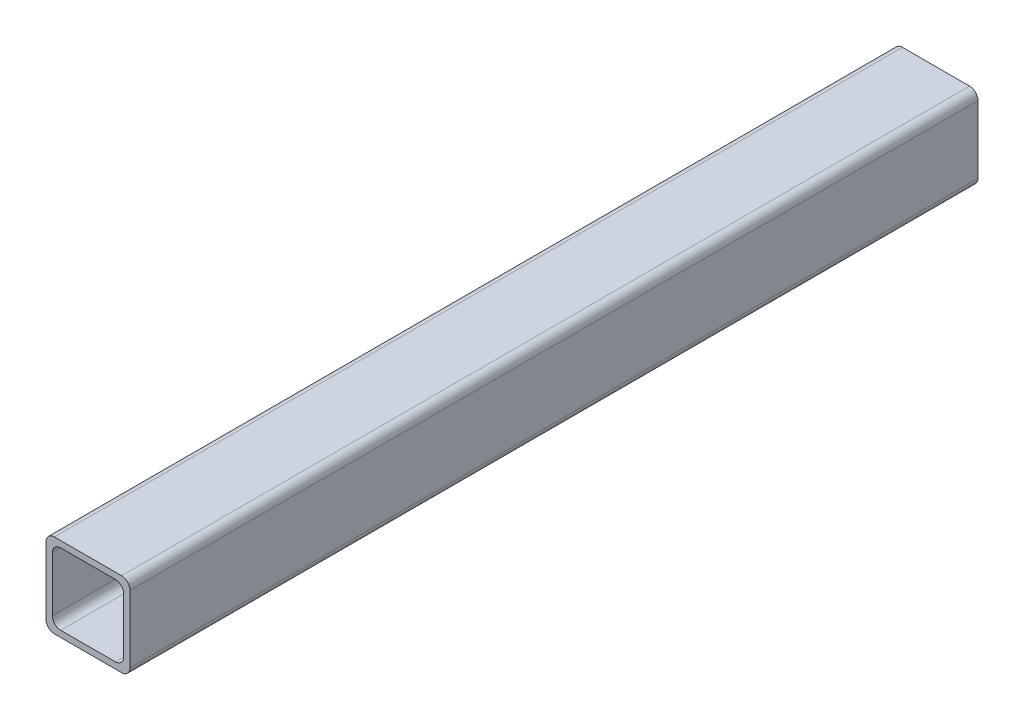
ISO-10303-21;
HEADER;
FILE_DESCRIPTION(('STEP AP214'),'2;1');
FILE_NAME('part.step','',(''),(''),'','','');
FILE_SCHEMA(('AUTOMOTIVE_DESIGN { 1 0 10303 214 1 1 1 1 }'));
ENDSEC;
DATA;
#1=APPLICATION_CONTEXT('core data for automotive mechanical design processes');
#2=APPLICATION_PROTOCOL_DEFINITION('international standard','automotive_design',2000,#1);
#3=PRODUCT_CONTEXT('',#1,'mechanical');
#4=PRODUCT('Part','Part','',(#3));
#5=PRODUCT_RELATED_PRODUCT_CATEGORY('part','',(#4));
#6=PRODUCT_DEFINITION_FORMATION('','',#4);
#7=PRODUCT_DEFINITION_CONTEXT('part definition',#1,'design');
#8=PRODUCT_DEFINITION('design','',#6,#7);
#9=PRODUCT_DEFINITION_SHAPE('','',#8);
#10=(LENGTH_UNIT() NAMED_UNIT(*) SI_UNIT(.MILLI.,.METRE.));
#11=(NAMED_UNIT(*) PLANE_ANGLE_UNIT() SI_UNIT($,.RADIAN.));
#12=(NAMED_UNIT(*) SI_UNIT($,.STERADIAN.) SOLID_ANGLE_UNIT());
#13=UNCERTAINTY_MEASURE_WITH_UNIT(LENGTH_MEASURE(1.E-05),#10,'distance_accuracy_value','');
#14=(GEOMETRIC_REPRESENTATION_CONTEXT(3) GLOBAL_UNCERTAINTY_ASSIGNED_CONTEXT((#13)) GLOBAL_UNIT_ASSIGNED_CONTEXT((#10,
#11,#12)) REPRESENTATION_CONTEXT('',''));
#15=CARTESIAN_POINT('',(0.,0.,0.));
#16=DIRECTION('',(0.,0.,1.));
#17=DIRECTION('',(1.,0.,0.));
#18=AXIS2_PLACEMENT_3D('',#15,#16,#17);
#19=CARTESIAN_POINT('',(0.,0.,202.));
#20=DIRECTION('',(0.,0.,1.));
#21=DIRECTION('',(1.,0.,0.));
#22=AXIS2_PLACEMENT_3D('',#19,#20,#21);
#23=PLANE('',#22);
#24=DIRECTION('',(1.,0.,0.));
#25=VECTOR('',#24,1.);
#26=CARTESIAN_POINT('',(-9.99999999999999,-10.,202.));
#27=LINE('',#26,#25);
#28=CARTESIAN_POINT('',(-7.99999999999999,-10.,202.));
#29=VERTEX_POINT('',#28);
#30=CARTESIAN_POINT('',(8.00000000000001,-10.,202.));
#31=VERTEX_POINT('',#30);
#32=EDGE_CURVE('E197',#29,#31,#27,.T.);
#33=ORIENTED_EDGE('',*,*,#32,.T.);
#34=CARTESIAN_POINT('',(8.00000000000001,-8.00000000000001,202.));
#35=DIRECTION('',(0.,0.,1.));
#36=DIRECTION('',(1.,0.,0.));
#37=AXIS2_PLACEMENT_3D('',#34,#35,#36);
#38=CIRCLE('',#37,2.);
#39=CARTESIAN_POINT('',(10.,-8.00000000000001,202.));
#40=VERTEX_POINT('',#39);
#41=EDGE_CURVE('E228',#31,#40,#38,.T.);
#42=ORIENTED_EDGE('',*,*,#41,.T.);
#43=DIRECTION('',(0.,1.,0.));
#44=VECTOR('',#43,1.);
#45=CARTESIAN_POINT('',(10.,10.,202.));
#46=LINE('',#45,#44);
#47=CARTESIAN_POINT('',(10.,8.,202.));
#48=VERTEX_POINT('',#47);
#49=EDGE_CURVE('E175',#40,#48,#46,.T.);
#50=ORIENTED_EDGE('',*,*,#49,.T.);
#51=CARTESIAN_POINT('',(8.00000000000001,8.,202.));
#52=DIRECTION('',(0.,0.,1.));
#53=DIRECTION('',(1.,0.,0.));
#54=AXIS2_PLACEMENT_3D('',#51,#52,#53);
#55=CIRCLE('',#54,2.);
#56=CARTESIAN_POINT('',(8.00000000000001,10.,202.));
#57=VERTEX_POINT('',#56);
#58=EDGE_CURVE('E222',#48,#57,#55,.T.);
#59=ORIENTED_EDGE('',*,*,#58,.T.);
#60=DIRECTION('',(-1.,0.,0.));
#61=VECTOR('',#60,1.);
#62=CARTESIAN_POINT('',(-10.,10.,202.));
#63=LINE('',#62,#61);
#64=CARTESIAN_POINT('',(-8.,10.,202.));
#65=VERTEX_POINT('',#64);
#66=EDGE_CURVE('E334',#57,#65,#63,.T.);
#67=ORIENTED_EDGE('',*,*,#66,.T.);
#68=CARTESIAN_POINT('',(-8.,8.,202.));
#69=DIRECTION('',(0.,0.,1.));
#70=DIRECTION('',(1.,0.,0.));
#71=AXIS2_PLACEMENT_3D('',#68,#69,#70);
#72=CIRCLE('',#71,2.);
#73=CARTESIAN_POINT('',(-10.,8.,202.));
#74=VERTEX_POINT('',#73);
#75=EDGE_CURVE('E219',#65,#74,#72,.T.);
#76=ORIENTED_EDGE('',*,*,#75,.T.);
#77=DIRECTION('',(0.,-1.,0.));
#78=VECTOR('',#77,1.);
#79=CARTESIAN_POINT('',(-10.,10.,202.));
#80=LINE('',#79,#78);
#81=CARTESIAN_POINT('',(-9.99999999999999,-8.00000000000001,202.));
#82=VERTEX_POINT('',#81);
#83=EDGE_CURVE('E337',#74,#82,#80,.T.);
#84=ORIENTED_EDGE('',*,*,#83,.T.);
#85=CARTESIAN_POINT('',(-7.99999999999999,-8.,202.));
#86=DIRECTION('',(0.,0.,1.));
#87=DIRECTION('',(1.,0.,0.));
#88=AXIS2_PLACEMENT_3D('',#85,#86,#87);
#89=CIRCLE('',#88,2.);
#90=EDGE_CURVE('E225',#82,#29,#89,.T.);
#91=ORIENTED_EDGE('',*,*,#90,.T.);
#92=EDGE_LOOP('',(#33,#42,#50,#59,#67,#76,#84,#91));
#93=FACE_BOUND('',#92,.T.);
#94=DIRECTION('',(1.,0.,0.));
#95=VECTOR('',#94,1.);
#96=CARTESIAN_POINT('',(-8.5,-8.50000000000001,202.));
#97=LINE('',#96,#95);
#98=CARTESIAN_POINT('',(-6.5,-8.50000000000001,202.));
#99=VERTEX_POINT('',#98);
#100=CARTESIAN_POINT('',(6.5,-8.5,202.));
#101=VERTEX_POINT('',#100);
#102=EDGE_CURVE('E313',#99,#101,#97,.T.);
#103=ORIENTED_EDGE('',*,*,#102,.F.);
#104=CARTESIAN_POINT('',(-6.5,-6.50000000000001,202.));
#105=DIRECTION('',(0.,0.,1.));
#106=DIRECTION('',(1.,0.,0.));
#107=AXIS2_PLACEMENT_3D('',#104,#105,#106);
#108=CIRCLE('',#107,2.);
#109=CARTESIAN_POINT('',(-8.5,-6.50000000000001,202.));
#110=VERTEX_POINT('',#109);
#111=EDGE_CURVE('E11',#99,#110,#108,.F.);
#112=ORIENTED_EDGE('',*,*,#111,.T.);
#113=DIRECTION('',(0.,-1.,0.));
#114=VECTOR('',#113,1.);
#115=CARTESIAN_POINT('',(-8.5,8.5,202.));
#116=LINE('',#115,#114);
#117=CARTESIAN_POINT('',(-8.5,6.5,202.));
#118=VERTEX_POINT('',#117);
#119=EDGE_CURVE('E311',#118,#110,#116,.T.);
#120=ORIENTED_EDGE('',*,*,#119,.F.);
#121=CARTESIAN_POINT('',(-6.5,6.5,202.));
#122=DIRECTION('',(0.,0.,1.));
#123=DIRECTION('',(1.,0.,0.));
#124=AXIS2_PLACEMENT_3D('',#121,#122,#123);
#125=CIRCLE('',#124,2.);
#126=CARTESIAN_POINT('',(-6.5,8.5,202.));
#127=VERTEX_POINT('',#126);
#128=EDGE_CURVE('E281',#118,#127,#125,.F.);
#129=ORIENTED_EDGE('',*,*,#128,.T.);
#130=DIRECTION('',(-1.,0.,0.));
#131=VECTOR('',#130,1.);
#132=CARTESIAN_POINT('',(-8.5,8.5,202.));
#133=LINE('',#132,#131);
#134=CARTESIAN_POINT('',(6.5,8.5,202.));
#135=VERTEX_POINT('',#134);
#136=EDGE_CURVE('E186',#135,#127,#133,.T.);
#137=ORIENTED_EDGE('',*,*,#136,.F.);
#138=CARTESIAN_POINT('',(6.5,6.5,202.));
#139=DIRECTION('',(0.,0.,1.));
#140=DIRECTION('',(1.,0.,0.));
#141=AXIS2_PLACEMENT_3D('',#138,#139,#140);
#142=CIRCLE('',#141,2.);
#143=CARTESIAN_POINT('',(8.5,6.5,202.));
#144=VERTEX_POINT('',#143);
#145=EDGE_CURVE('E55',#135,#144,#142,.F.);
#146=ORIENTED_EDGE('',*,*,#145,.T.);
#147=DIRECTION('',(0.,1.,0.));
#148=VECTOR('',#147,1.);
#149=CARTESIAN_POINT('',(8.5,8.5,202.));
#150=LINE('',#149,#148);
#151=CARTESIAN_POINT('',(8.5,-6.5,202.));
#152=VERTEX_POINT('',#151);
#153=EDGE_CURVE('E194',#152,#144,#150,.T.);
#154=ORIENTED_EDGE('',*,*,#153,.F.);
#155=CARTESIAN_POINT('',(6.5,-6.5,202.));
#156=DIRECTION('',(0.,0.,1.));
#157=DIRECTION('',(1.,0.,0.));
#158=AXIS2_PLACEMENT_3D('',#155,#156,#157);
#159=CIRCLE('',#158,2.);
#160=EDGE_CURVE('E275',#152,#101,#159,.F.);
#161=ORIENTED_EDGE('',*,*,#160,.T.);
#162=EDGE_LOOP('',(#103,#112,#120,#129,#137,#146,#154,#161));
#163=FACE_BOUND('',#162,.T.);
#164=ADVANCED_FACE('F39',(#93,#163),#23,.T.);
#165=CARTESIAN_POINT('',(0.,0.,0.));
#166=DIRECTION('',(0.,0.,1.));
#167=DIRECTION('',(1.,0.,0.));
#168=AXIS2_PLACEMENT_3D('',#165,#166,#167);
#169=PLANE('',#168);
#170=DIRECTION('',(0.,1.,0.));
#171=VECTOR('',#170,1.);
#172=CARTESIAN_POINT('',(10.,10.,0.));
#173=LINE('',#172,#171);
#174=CARTESIAN_POINT('',(10.,-8.00000000000001,0.));
#175=VERTEX_POINT('',#174);
#176=CARTESIAN_POINT('',(10.,8.,0.));
#177=VERTEX_POINT('',#176);
#178=EDGE_CURVE('E172',#175,#177,#173,.T.);
#179=ORIENTED_EDGE('',*,*,#178,.F.);
#180=CARTESIAN_POINT('',(8.00000000000001,-8.00000000000001,0.));
#181=DIRECTION('',(0.,0.,1.));
#182=DIRECTION('',(1.,0.,0.));
#183=AXIS2_PLACEMENT_3D('',#180,#181,#182);
#184=CIRCLE('',#183,2.);
#185=CARTESIAN_POINT('',(8.00000000000001,-10.,0.));
#186=VERTEX_POINT('',#185);
#187=EDGE_CURVE('E154',#175,#186,#184,.F.);
#188=ORIENTED_EDGE('',*,*,#187,.T.);
#189=DIRECTION('',(1.,0.,0.));
#190=VECTOR('',#189,1.);
#191=CARTESIAN_POINT('',(-9.99999999999999,-10.,0.));
#192=LINE('',#191,#190);
#193=CARTESIAN_POINT('',(-7.99999999999999,-10.,0.));
#194=VERTEX_POINT('',#193);
#195=EDGE_CURVE('E203',#194,#186,#192,.T.);
#196=ORIENTED_EDGE('',*,*,#195,.F.);
#197=CARTESIAN_POINT('',(-7.99999999999999,-8.,0.));
#198=DIRECTION('',(0.,0.,1.));
#199=DIRECTION('',(1.,0.,0.));
#200=AXIS2_PLACEMENT_3D('',#197,#198,#199);
#201=CIRCLE('',#200,2.);
#202=CARTESIAN_POINT('',(-9.99999999999999,-8.00000000000001,0.));
#203=VERTEX_POINT('',#202);
#204=EDGE_CURVE('E166',#194,#203,#201,.F.);
#205=ORIENTED_EDGE('',*,*,#204,.T.);
#206=DIRECTION('',(0.,-1.,0.));
#207=VECTOR('',#206,1.);
#208=CARTESIAN_POINT('',(-10.,10.,0.));
#209=LINE('',#208,#207);
#210=CARTESIAN_POINT('',(-10.,8.,0.));
#211=VERTEX_POINT('',#210);
#212=EDGE_CURVE('E191',#211,#203,#209,.T.);
#213=ORIENTED_EDGE('',*,*,#212,.F.);
#214=CARTESIAN_POINT('',(-8.,8.,0.));
#215=DIRECTION('',(0.,0.,1.));
#216=DIRECTION('',(1.,0.,0.));
#217=AXIS2_PLACEMENT_3D('',#214,#215,#216);
#218=CIRCLE('',#217,2.);
#219=CARTESIAN_POINT('',(-8.,10.,0.));
#220=VERTEX_POINT('',#219);
#221=EDGE_CURVE('E177',#211,#220,#218,.F.);
#222=ORIENTED_EDGE('',*,*,#221,.T.);
#223=DIRECTION('',(-1.,0.,0.));
#224=VECTOR('',#223,1.);
#225=CARTESIAN_POINT('',(-10.,10.,0.));
#226=LINE('',#225,#224);
#227=CARTESIAN_POINT('',(8.00000000000001,10.,0.));
#228=VERTEX_POINT('',#227);
#229=EDGE_CURVE('E185',#228,#220,#226,.T.);
#230=ORIENTED_EDGE('',*,*,#229,.F.);
#231=CARTESIAN_POINT('',(8.00000000000001,8.,0.));
#232=DIRECTION('',(0.,0.,1.));
#233=DIRECTION('',(1.,0.,0.));
#234=AXIS2_PLACEMENT_3D('',#231,#232,#233);
#235=CIRCLE('',#234,2.);
#236=EDGE_CURVE('E183',#228,#177,#235,.F.);
#237=ORIENTED_EDGE('',*,*,#236,.T.);
#238=EDGE_LOOP('',(#179,#188,#196,#205,#213,#222,#230,#237));
#239=FACE_BOUND('',#238,.T.);
#240=DIRECTION('',(-1.,0.,0.));
#241=VECTOR('',#240,1.);
#242=CARTESIAN_POINT('',(-8.5,8.5,0.));
#243=LINE('',#242,#241);
#244=CARTESIAN_POINT('',(6.5,8.5,0.));
#245=VERTEX_POINT('',#244);
#246=CARTESIAN_POINT('',(-6.5,8.5,0.));
#247=VERTEX_POINT('',#246);
#248=EDGE_CURVE('E318',#245,#247,#243,.T.);
#249=ORIENTED_EDGE('',*,*,#248,.T.);
#250=CARTESIAN_POINT('',(-6.5,6.5,0.));
#251=DIRECTION('',(0.,0.,1.));
#252=DIRECTION('',(1.,0.,0.));
#253=AXIS2_PLACEMENT_3D('',#250,#251,#252);
#254=CIRCLE('',#253,2.);
#255=CARTESIAN_POINT('',(-8.5,6.5,0.));
#256=VERTEX_POINT('',#255);
#257=EDGE_CURVE('E278',#247,#256,#254,.T.);
#258=ORIENTED_EDGE('',*,*,#257,.T.);
#259=DIRECTION('',(0.,-1.,0.));
#260=VECTOR('',#259,1.);
#261=CARTESIAN_POINT('',(-8.5,8.5,0.));
#262=LINE('',#261,#260);
#263=CARTESIAN_POINT('',(-8.5,-6.50000000000001,0.));
#264=VERTEX_POINT('',#263);
#265=EDGE_CURVE('E295',#256,#264,#262,.T.);
#266=ORIENTED_EDGE('',*,*,#265,.T.);
#267=CARTESIAN_POINT('',(-6.5,-6.50000000000001,0.));
#268=DIRECTION('',(0.,0.,1.));
#269=DIRECTION('',(1.,0.,0.));
#270=AXIS2_PLACEMENT_3D('',#267,#268,#269);
#271=CIRCLE('',#270,2.);
#272=CARTESIAN_POINT('',(-6.5,-8.50000000000001,0.));
#273=VERTEX_POINT('',#272);
#274=EDGE_CURVE('E48',#264,#273,#271,.T.);
#275=ORIENTED_EDGE('',*,*,#274,.T.);
#276=DIRECTION('',(1.,0.,0.));
#277=VECTOR('',#276,1.);
#278=CARTESIAN_POINT('',(-8.5,-8.50000000000001,0.));
#279=LINE('',#278,#277);
#280=CARTESIAN_POINT('',(6.5,-8.5,0.));
#281=VERTEX_POINT('',#280);
#282=EDGE_CURVE('E293',#273,#281,#279,.T.);
#283=ORIENTED_EDGE('',*,*,#282,.T.);
#284=CARTESIAN_POINT('',(6.5,-6.5,0.));
#285=DIRECTION('',(0.,0.,1.));
#286=DIRECTION('',(1.,0.,0.));
#287=AXIS2_PLACEMENT_3D('',#284,#285,#286);
#288=CIRCLE('',#287,2.);
#289=CARTESIAN_POINT('',(8.5,-6.5,0.));
#290=VERTEX_POINT('',#289);
#291=EDGE_CURVE('E272',#281,#290,#288,.T.);
#292=ORIENTED_EDGE('',*,*,#291,.T.);
#293=DIRECTION('',(0.,1.,0.));
#294=VECTOR('',#293,1.);
#295=CARTESIAN_POINT('',(8.5,8.5,0.));
#296=LINE('',#295,#294);
#297=CARTESIAN_POINT('',(8.5,6.5,0.));
#298=VERTEX_POINT('',#297);
#299=EDGE_CURVE('E305',#290,#298,#296,.T.);
#300=ORIENTED_EDGE('',*,*,#299,.T.);
#301=CARTESIAN_POINT('',(6.5,6.5,0.));
#302=DIRECTION('',(0.,0.,1.));
#303=DIRECTION('',(1.,0.,0.));
#304=AXIS2_PLACEMENT_3D('',#301,#302,#303);
#305=CIRCLE('',#304,2.);
#306=EDGE_CURVE('E284',#298,#245,#305,.T.);
#307=ORIENTED_EDGE('',*,*,#306,.T.);
#308=EDGE_LOOP('',(#249,#258,#266,#275,#283,#292,#300,#307));
#309=FACE_BOUND('',#308,.T.);
#310=ADVANCED_FACE('F180',(#239,#309),#169,.F.);
#311=CARTESIAN_POINT('',(10.,10.,202.));
#312=DIRECTION('',(-1.,0.,0.));
#313=DIRECTION('',(0.,-1.,0.));
#314=AXIS2_PLACEMENT_3D('',#311,#312,#313);
#315=PLANE('',#314);
#316=ORIENTED_EDGE('',*,*,#49,.F.);
#317=DIRECTION('',(0.,0.,-1.));
#318=VECTOR('',#317,1.);
#319=CARTESIAN_POINT('',(10.,-8.00000000000001,202.));
#320=LINE('',#319,#318);
#321=EDGE_CURVE('E158',#40,#175,#320,.T.);
#322=ORIENTED_EDGE('',*,*,#321,.T.);
#323=ORIENTED_EDGE('',*,*,#178,.T.);
#324=DIRECTION('',(0.,0.,-1.));
#325=VECTOR('',#324,1.);
#326=CARTESIAN_POINT('',(10.,8.,202.));
#327=LINE('',#326,#325);
#328=EDGE_CURVE('E178',#177,#48,#327,.F.);
#329=ORIENTED_EDGE('',*,*,#328,.T.);
#330=EDGE_LOOP('',(#316,#322,#323,#329));
#331=FACE_BOUND('',#330,.T.);
#332=ADVANCED_FACE('F171',(#331),#315,.F.);
#333=CARTESIAN_POINT('',(-10.,10.,202.));
#334=DIRECTION('',(0.,-1.,0.));
#335=DIRECTION('',(0.,0.,-1.));
#336=AXIS2_PLACEMENT_3D('',#333,#334,#335);
#337=PLANE('',#336);
#338=ORIENTED_EDGE('',*,*,#66,.F.);
#339=DIRECTION('',(0.,0.,-1.));
#340=VECTOR('',#339,1.);
#341=CARTESIAN_POINT('',(8.00000000000001,10.,202.));
#342=LINE('',#341,#340);
#343=EDGE_CURVE('E268',#57,#228,#342,.T.);
#344=ORIENTED_EDGE('',*,*,#343,.T.);
#345=ORIENTED_EDGE('',*,*,#229,.T.);
#346=DIRECTION('',(0.,0.,-1.));
#347=VECTOR('',#346,1.);
#348=CARTESIAN_POINT('',(-8.,10.,202.));
#349=LINE('',#348,#347);
#350=EDGE_CURVE('E265',#220,#65,#349,.F.);
#351=ORIENTED_EDGE('',*,*,#350,.T.);
#352=EDGE_LOOP('',(#338,#344,#345,#351));
#353=FACE_BOUND('',#352,.T.);
#354=ADVANCED_FACE('F361',(#353),#337,.F.);
#355=CARTESIAN_POINT('',(-10.,10.,202.));
#356=DIRECTION('',(1.,0.,0.));
#357=DIRECTION('',(0.,1.,0.));
#358=AXIS2_PLACEMENT_3D('',#355,#356,#357);
#359=PLANE('',#358);
#360=ORIENTED_EDGE('',*,*,#212,.T.);
#361=DIRECTION('',(0.,0.,-1.));
#362=VECTOR('',#361,1.);
#363=CARTESIAN_POINT('',(-9.99999999999999,-8.00000000000001,202.));
#364=LINE('',#363,#362);
#365=EDGE_CURVE('E262',#203,#82,#364,.F.);
#366=ORIENTED_EDGE('',*,*,#365,.T.);
#367=ORIENTED_EDGE('',*,*,#83,.F.);
#368=DIRECTION('',(0.,0.,-1.));
#369=VECTOR('',#368,1.);
#370=CARTESIAN_POINT('',(-10.,8.,202.));
#371=LINE('',#370,#369);
#372=EDGE_CURVE('E258',#74,#211,#371,.T.);
#373=ORIENTED_EDGE('',*,*,#372,.T.);
#374=EDGE_LOOP('',(#360,#366,#367,#373));
#375=FACE_BOUND('',#374,.T.);
#376=ADVANCED_FACE('F354',(#375),#359,.F.);
#377=CARTESIAN_POINT('',(-9.99999999999999,-10.,202.));
#378=DIRECTION('',(0.,1.,0.));
#379=DIRECTION('',(0.,0.,1.));
#380=AXIS2_PLACEMENT_3D('',#377,#378,#379);
#381=PLANE('',#380);
#382=ORIENTED_EDGE('',*,*,#195,.T.);
#383=DIRECTION('',(0.,0.,-1.));
#384=VECTOR('',#383,1.);
#385=CARTESIAN_POINT('',(8.00000000000001,-10.,202.));
#386=LINE('',#385,#384);
#387=EDGE_CURVE('E159',#186,#31,#386,.F.);
#388=ORIENTED_EDGE('',*,*,#387,.T.);
#389=ORIENTED_EDGE('',*,*,#32,.F.);
#390=DIRECTION('',(0.,0.,-1.));
#391=VECTOR('',#390,1.);
#392=CARTESIAN_POINT('',(-7.99999999999999,-10.,202.));
#393=LINE('',#392,#391);
#394=EDGE_CURVE('E165',#29,#194,#393,.T.);
#395=ORIENTED_EDGE('',*,*,#394,.T.);
#396=EDGE_LOOP('',(#382,#388,#389,#395));
#397=FACE_BOUND('',#396,.T.);
#398=ADVANCED_FACE('F348',(#397),#381,.F.);
#399=CARTESIAN_POINT('',(-8.5,8.5,202.));
#400=DIRECTION('',(1.,0.,0.));
#401=DIRECTION('',(0.,0.,-1.));
#402=AXIS2_PLACEMENT_3D('',#399,#400,#401);
#403=PLANE('',#402);
#404=ORIENTED_EDGE('',*,*,#265,.F.);
#405=DIRECTION('',(0.,0.,-1.));
#406=VECTOR('',#405,1.);
#407=CARTESIAN_POINT('',(-8.5,6.5,202.));
#408=LINE('',#407,#406);
#409=EDGE_CURVE('E255',#256,#118,#408,.F.);
#410=ORIENTED_EDGE('',*,*,#409,.T.);
#411=ORIENTED_EDGE('',*,*,#119,.T.);
#412=DIRECTION('',(0.,0.,-1.));
#413=VECTOR('',#412,1.);
#414=CARTESIAN_POINT('',(-8.5,-6.50000000000001,0.));
#415=LINE('',#414,#413);
#416=EDGE_CURVE('E251',#110,#264,#415,.T.);
#417=ORIENTED_EDGE('',*,*,#416,.T.);
#418=EDGE_LOOP('',(#404,#410,#411,#417));
#419=FACE_BOUND('',#418,.T.);
#420=ADVANCED_FACE('F315',(#419),#403,.T.);
#421=CARTESIAN_POINT('',(-8.5,-8.50000000000001,202.));
#422=DIRECTION('',(0.,1.,0.));
#423=DIRECTION('',(-1.,0.,0.));
#424=AXIS2_PLACEMENT_3D('',#421,#422,#423);
#425=PLANE('',#424);
#426=ORIENTED_EDGE('',*,*,#102,.T.);
#427=DIRECTION('',(0.,0.,-1.));
#428=VECTOR('',#427,1.);
#429=CARTESIAN_POINT('',(6.5,-8.5,0.));
#430=LINE('',#429,#428);
#431=EDGE_CURVE('E234',#101,#281,#430,.T.);
#432=ORIENTED_EDGE('',*,*,#431,.T.);
#433=ORIENTED_EDGE('',*,*,#282,.F.);
#434=DIRECTION('',(0.,0.,-1.));
#435=VECTOR('',#434,1.);
#436=CARTESIAN_POINT('',(-6.5,-8.50000000000001,202.));
#437=LINE('',#436,#435);
#438=EDGE_CURVE('E231',#273,#99,#437,.F.);
#439=ORIENTED_EDGE('',*,*,#438,.T.);
#440=EDGE_LOOP('',(#426,#432,#433,#439));
#441=FACE_BOUND('',#440,.T.);
#442=ADVANCED_FACE('F301',(#441),#425,.T.);
#443=CARTESIAN_POINT('',(8.5,8.5,202.));
#444=DIRECTION('',(-1.,0.,0.));
#445=DIRECTION('',(0.,0.,1.));
#446=AXIS2_PLACEMENT_3D('',#443,#444,#445);
#447=PLANE('',#446);
#448=ORIENTED_EDGE('',*,*,#299,.F.);
#449=DIRECTION('',(0.,0.,-1.));
#450=VECTOR('',#449,1.);
#451=CARTESIAN_POINT('',(8.5,-6.5,202.));
#452=LINE('',#451,#450);
#453=EDGE_CURVE('E62',#290,#152,#452,.F.);
#454=ORIENTED_EDGE('',*,*,#453,.T.);
#455=ORIENTED_EDGE('',*,*,#153,.T.);
#456=DIRECTION('',(0.,0.,-1.));
#457=VECTOR('',#456,1.);
#458=CARTESIAN_POINT('',(8.5,6.5,0.));
#459=LINE('',#458,#457);
#460=EDGE_CURVE('E238',#144,#298,#459,.T.);
#461=ORIENTED_EDGE('',*,*,#460,.T.);
#462=EDGE_LOOP('',(#448,#454,#455,#461));
#463=FACE_BOUND('',#462,.T.);
#464=ADVANCED_FACE('F454',(#463),#447,.T.);
#465=CARTESIAN_POINT('',(-8.5,8.5,202.));
#466=DIRECTION('',(0.,-1.,0.));
#467=DIRECTION('',(0.,0.,-1.));
#468=AXIS2_PLACEMENT_3D('',#465,#466,#467);
#469=PLANE('',#468);
#470=ORIENTED_EDGE('',*,*,#136,.T.);
#471=DIRECTION('',(0.,0.,-1.));
#472=VECTOR('',#471,1.);
#473=CARTESIAN_POINT('',(-6.5,8.5,0.));
#474=LINE('',#473,#472);
#475=EDGE_CURVE('E247',#127,#247,#474,.T.);
#476=ORIENTED_EDGE('',*,*,#475,.T.);
#477=ORIENTED_EDGE('',*,*,#248,.F.);
#478=DIRECTION('',(0.,0.,-1.));
#479=VECTOR('',#478,1.);
#480=CARTESIAN_POINT('',(6.5,8.5,202.));
#481=LINE('',#480,#479);
#482=EDGE_CURVE('E244',#245,#135,#481,.F.);
#483=ORIENTED_EDGE('',*,*,#482,.T.);
#484=EDGE_LOOP('',(#470,#476,#477,#483));
#485=FACE_BOUND('',#484,.T.);
#486=ADVANCED_FACE('F392',(#485),#469,.T.);
#487=CARTESIAN_POINT('',(8.00000000000001,-8.00000000000001,202.));
#488=DIRECTION('',(0.,0.,-1.));
#489=DIRECTION('',(-1.,0.,0.));
#490=AXIS2_PLACEMENT_3D('',#487,#488,#489);
#491=CYLINDRICAL_SURFACE('',#490,2.);
#492=ORIENTED_EDGE('',*,*,#41,.F.);
#493=ORIENTED_EDGE('',*,*,#387,.F.);
#494=ORIENTED_EDGE('',*,*,#187,.F.);
#495=ORIENTED_EDGE('',*,*,#321,.F.);
#496=EDGE_LOOP('',(#492,#493,#494,#495));
#497=FACE_BOUND('',#496,.T.);
#498=ADVANCED_FACE('F157',(#497),#491,.T.);
#499=CARTESIAN_POINT('',(6.5,-6.5,202.));
#500=DIRECTION('',(0.,0.,1.));
#501=DIRECTION('',(1.,0.,0.));
#502=AXIS2_PLACEMENT_3D('',#499,#500,#501);
#503=CYLINDRICAL_SURFACE('',#502,2.);
#504=ORIENTED_EDGE('',*,*,#160,.F.);
#505=ORIENTED_EDGE('',*,*,#453,.F.);
#506=ORIENTED_EDGE('',*,*,#291,.F.);
#507=ORIENTED_EDGE('',*,*,#431,.F.);
#508=EDGE_LOOP('',(#504,#505,#506,#507));
#509=FACE_BOUND('',#508,.T.);
#510=ADVANCED_FACE('F391',(#509),#503,.F.);
#511=CARTESIAN_POINT('',(-6.5,6.5,202.));
#512=DIRECTION('',(0.,0.,1.));
#513=DIRECTION('',(1.,0.,0.));
#514=AXIS2_PLACEMENT_3D('',#511,#512,#513);
#515=CYLINDRICAL_SURFACE('',#514,2.);
#516=ORIENTED_EDGE('',*,*,#128,.F.);
#517=ORIENTED_EDGE('',*,*,#409,.F.);
#518=ORIENTED_EDGE('',*,*,#257,.F.);
#519=ORIENTED_EDGE('',*,*,#475,.F.);
#520=EDGE_LOOP('',(#516,#517,#518,#519));
#521=FACE_BOUND('',#520,.T.);
#522=ADVANCED_FACE('F395',(#521),#515,.F.);
#523=CARTESIAN_POINT('',(6.5,6.5,202.));
#524=DIRECTION('',(0.,0.,1.));
#525=DIRECTION('',(1.,0.,0.));
#526=AXIS2_PLACEMENT_3D('',#523,#524,#525);
#527=CYLINDRICAL_SURFACE('',#526,2.);
#528=ORIENTED_EDGE('',*,*,#145,.F.);
#529=ORIENTED_EDGE('',*,*,#482,.F.);
#530=ORIENTED_EDGE('',*,*,#306,.F.);
#531=ORIENTED_EDGE('',*,*,#460,.F.);
#532=EDGE_LOOP('',(#528,#529,#530,#531));
#533=FACE_BOUND('',#532,.T.);
#534=ADVANCED_FACE('F399',(#533),#527,.F.);
#535=CARTESIAN_POINT('',(-6.5,-6.50000000000001,202.));
#536=DIRECTION('',(0.,0.,1.));
#537=DIRECTION('',(1.,0.,0.));
#538=AXIS2_PLACEMENT_3D('',#535,#536,#537);
#539=CYLINDRICAL_SURFACE('',#538,2.);
#540=ORIENTED_EDGE('',*,*,#111,.F.);
#541=ORIENTED_EDGE('',*,*,#438,.F.);
#542=ORIENTED_EDGE('',*,*,#274,.F.);
#543=ORIENTED_EDGE('',*,*,#416,.F.);
#544=EDGE_LOOP('',(#540,#541,#542,#543));
#545=FACE_BOUND('',#544,.T.);
#546=ADVANCED_FACE('F308',(#545),#539,.F.);
#547=CARTESIAN_POINT('',(-7.99999999999999,-8.,202.));
#548=DIRECTION('',(0.,0.,-1.));
#549=DIRECTION('',(-1.,0.,0.));
#550=AXIS2_PLACEMENT_3D('',#547,#548,#549);
#551=CYLINDRICAL_SURFACE('',#550,2.);
#552=ORIENTED_EDGE('',*,*,#90,.F.);
#553=ORIENTED_EDGE('',*,*,#365,.F.);
#554=ORIENTED_EDGE('',*,*,#204,.F.);
#555=ORIENTED_EDGE('',*,*,#394,.F.);
#556=EDGE_LOOP('',(#552,#553,#554,#555));
#557=FACE_BOUND('',#556,.T.);
#558=ADVANCED_FACE('F350',(#557),#551,.T.);
#559=CARTESIAN_POINT('',(8.00000000000001,8.,202.));
#560=DIRECTION('',(0.,0.,-1.));
#561=DIRECTION('',(-1.,0.,0.));
#562=AXIS2_PLACEMENT_3D('',#559,#560,#561);
#563=CYLINDRICAL_SURFACE('',#562,2.);
#564=ORIENTED_EDGE('',*,*,#58,.F.);
#565=ORIENTED_EDGE('',*,*,#328,.F.);
#566=ORIENTED_EDGE('',*,*,#236,.F.);
#567=ORIENTED_EDGE('',*,*,#343,.F.);
#568=EDGE_LOOP('',(#564,#565,#566,#567));
#569=FACE_BOUND('',#568,.T.);
#570=ADVANCED_FACE('F365',(#569),#563,.T.);
#571=CARTESIAN_POINT('',(-8.,8.,202.));
#572=DIRECTION('',(0.,0.,-1.));
#573=DIRECTION('',(-1.,0.,0.));
#574=AXIS2_PLACEMENT_3D('',#571,#572,#573);
#575=CYLINDRICAL_SURFACE('',#574,2.);
#576=ORIENTED_EDGE('',*,*,#75,.F.);
#577=ORIENTED_EDGE('',*,*,#350,.F.);
#578=ORIENTED_EDGE('',*,*,#221,.F.);
#579=ORIENTED_EDGE('',*,*,#372,.F.);
#580=EDGE_LOOP('',(#576,#577,#578,#579));
#581=FACE_BOUND('',#580,.T.);
#582=ADVANCED_FACE('F41',(#581),#575,.T.);
#583=CLOSED_SHELL('',(#164,#310,#332,#354,#376,#398,#420,#442,#464,#486,#498,#510,#522,#534,
#546,#558,#570,#582));
#584=MANIFOLD_SOLID_BREP('B2',#583);
#585=ADVANCED_BREP_SHAPE_REPRESENTATION('',(#18,#584),#14);
#586=SHAPE_DEFINITION_REPRESENTATION(#9,#585);
ENDSEC;
END-ISO-10303-21;
